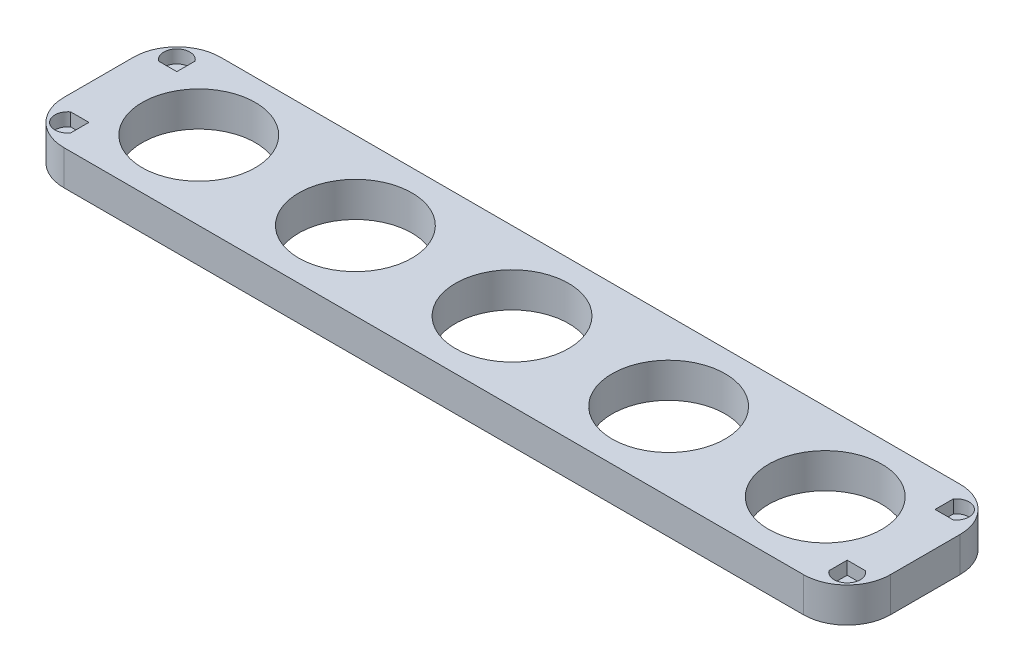
ISO-10303-21;
HEADER;
FILE_DESCRIPTION(('STEP AP214'),'2;1');
FILE_NAME('part.step','',(''),(''),'','','');
FILE_SCHEMA(('AUTOMOTIVE_DESIGN { 1 0 10303 214 1 1 1 1 }'));
ENDSEC;
DATA;
#1=APPLICATION_CONTEXT('core data for automotive mechanical design processes');
#2=APPLICATION_PROTOCOL_DEFINITION('international standard','automotive_design',2000,#1);
#3=PRODUCT_CONTEXT('',#1,'mechanical');
#4=PRODUCT('Part','Part','',(#3));
#5=PRODUCT_RELATED_PRODUCT_CATEGORY('part','',(#4));
#6=PRODUCT_DEFINITION_FORMATION('','',#4);
#7=PRODUCT_DEFINITION_CONTEXT('part definition',#1,'design');
#8=PRODUCT_DEFINITION('design','',#6,#7);
#9=PRODUCT_DEFINITION_SHAPE('','',#8);
#10=(LENGTH_UNIT() NAMED_UNIT(*) SI_UNIT(.MILLI.,.METRE.));
#11=(NAMED_UNIT(*) PLANE_ANGLE_UNIT() SI_UNIT($,.RADIAN.));
#12=(NAMED_UNIT(*) SI_UNIT($,.STERADIAN.) SOLID_ANGLE_UNIT());
#13=UNCERTAINTY_MEASURE_WITH_UNIT(LENGTH_MEASURE(1.E-05),#10,'distance_accuracy_value','');
#14=(GEOMETRIC_REPRESENTATION_CONTEXT(3) GLOBAL_UNCERTAINTY_ASSIGNED_CONTEXT((#13)) GLOBAL_UNIT_ASSIGNED_CONTEXT((#10,
#11,#12)) REPRESENTATION_CONTEXT('',''));
#15=CARTESIAN_POINT('',(0.,0.,0.));
#16=DIRECTION('',(0.,0.,1.));
#17=DIRECTION('',(1.,0.,0.));
#18=AXIS2_PLACEMENT_3D('',#15,#16,#17);
#19=CARTESIAN_POINT('',(0.,8.,0.));
#20=DIRECTION('',(0.,-1.,0.));
#21=DIRECTION('',(0.,0.,-1.));
#22=AXIS2_PLACEMENT_3D('',#19,#20,#21);
#23=PLANE('',#22);
#24=CARTESIAN_POINT('',(184.553451982046,8.,-30.5062125959102));
#25=DIRECTION('',(0.,-1.,0.));
#26=DIRECTION('',(0.,0.,-1.));
#27=AXIS2_PLACEMENT_3D('',#24,#25,#26);
#28=CIRCLE('',#27,3.00121510515277);
#29=CARTESIAN_POINT('',(182.147435554875,8.,-32.300196168739));
#30=VERTEX_POINT('',#29);
#31=CARTESIAN_POINT('',(186.347435554875,8.,-28.100196168739));
#32=VERTEX_POINT('',#31);
#33=EDGE_CURVE('E68',#30,#32,#28,.T.);
#34=ORIENTED_EDGE('',*,*,#33,.T.);
#35=DIRECTION('',(-1.,0.,0.));
#36=VECTOR('',#35,1.);
#37=CARTESIAN_POINT('',(186.347435554875,8.,-28.100196168739));
#38=LINE('',#37,#36);
#39=CARTESIAN_POINT('',(182.147435554875,8.,-28.100196168739));
#40=VERTEX_POINT('',#39);
#41=EDGE_CURVE('E268',#32,#40,#38,.T.);
#42=ORIENTED_EDGE('',*,*,#41,.T.);
#43=DIRECTION('',(0.,0.,-1.));
#44=VECTOR('',#43,1.);
#45=CARTESIAN_POINT('',(182.147435554875,8.,-28.100196168739));
#46=LINE('',#45,#44);
#47=EDGE_CURVE('E264',#40,#30,#46,.T.);
#48=ORIENTED_EDGE('',*,*,#47,.T.);
#49=EDGE_LOOP('',(#34,#42,#48));
#50=FACE_BOUND('',#49,.T.);
#51=CARTESIAN_POINT('',(184.553451982046,8.,-5.4937874040897));
#52=DIRECTION('',(0.,1.,0.));
#53=DIRECTION('',(0.,0.,1.));
#54=AXIS2_PLACEMENT_3D('',#51,#52,#53);
#55=CIRCLE('',#54,3.00121510515277);
#56=CARTESIAN_POINT('',(182.147435554875,8.,-3.69980383126085));
#57=VERTEX_POINT('',#56);
#58=CARTESIAN_POINT('',(186.347435554875,8.,-7.89980383126085));
#59=VERTEX_POINT('',#58);
#60=EDGE_CURVE('E206',#57,#59,#55,.T.);
#61=ORIENTED_EDGE('',*,*,#60,.F.);
#62=DIRECTION('',(0.,0.,1.));
#63=VECTOR('',#62,1.);
#64=CARTESIAN_POINT('',(182.147435554875,8.,-7.89980383126087));
#65=LINE('',#64,#63);
#66=CARTESIAN_POINT('',(182.147435554875,8.,-7.89980383126087));
#67=VERTEX_POINT('',#66);
#68=EDGE_CURVE('E189',#67,#57,#65,.T.);
#69=ORIENTED_EDGE('',*,*,#68,.F.);
#70=DIRECTION('',(-1.,0.,0.));
#71=VECTOR('',#70,1.);
#72=CARTESIAN_POINT('',(186.347435554875,8.,-7.89980383126086));
#73=LINE('',#72,#71);
#74=EDGE_CURVE('E200',#59,#67,#73,.T.);
#75=ORIENTED_EDGE('',*,*,#74,.F.);
#76=EDGE_LOOP('',(#61,#69,#75));
#77=FACE_BOUND('',#76,.T.);
#78=DIRECTION('',(0.,0.,-1.));
#79=VECTOR('',#78,1.);
#80=CARTESIAN_POINT('',(7.85256444512545,8.,-28.1001961687391));
#81=LINE('',#80,#79);
#82=CARTESIAN_POINT('',(7.85256444512545,8.,-28.1001961687391));
#83=VERTEX_POINT('',#82);
#84=CARTESIAN_POINT('',(7.85256444512545,8.,-32.3001961687391));
#85=VERTEX_POINT('',#84);
#86=EDGE_CURVE('E299',#83,#85,#81,.T.);
#87=ORIENTED_EDGE('',*,*,#86,.F.);
#88=DIRECTION('',(1.,0.,0.));
#89=VECTOR('',#88,1.);
#90=CARTESIAN_POINT('',(3.65256444512545,8.,-28.1001961687391));
#91=LINE('',#90,#89);
#92=CARTESIAN_POINT('',(3.65256444512544,8.,-28.1001961687391));
#93=VERTEX_POINT('',#92);
#94=EDGE_CURVE('E249',#93,#83,#91,.T.);
#95=ORIENTED_EDGE('',*,*,#94,.F.);
#96=CARTESIAN_POINT('',(5.44654801795428,8.,-30.5062125959102));
#97=DIRECTION('',(0.,1.,0.));
#98=DIRECTION('',(0.,0.,1.));
#99=AXIS2_PLACEMENT_3D('',#96,#97,#98);
#100=CIRCLE('',#99,3.00121510515278);
#101=EDGE_CURVE('E288',#85,#93,#100,.T.);
#102=ORIENTED_EDGE('',*,*,#101,.F.);
#103=EDGE_LOOP('',(#87,#95,#102));
#104=FACE_BOUND('',#103,.T.);
#105=CARTESIAN_POINT('',(23.,8.,-18.));
#106=DIRECTION('',(0.,1.,0.));
#107=DIRECTION('',(0.,0.,1.));
#108=AXIS2_PLACEMENT_3D('',#105,#106,#107);
#109=CIRCLE('',#108,13.);
#110=CARTESIAN_POINT('',(23.,8.,-4.99999999999999));
#111=VERTEX_POINT('',#110);
#112=EDGE_CURVE('E321',#111,#111,#109,.T.);
#113=ORIENTED_EDGE('',*,*,#112,.F.);
#114=EDGE_LOOP('',(#113));
#115=FACE_BOUND('',#114,.T.);
#116=CARTESIAN_POINT('',(59.,8.,-18.));
#117=DIRECTION('',(0.,1.,0.));
#118=DIRECTION('',(0.,0.,1.));
#119=AXIS2_PLACEMENT_3D('',#116,#117,#118);
#120=CIRCLE('',#119,13.);
#121=CARTESIAN_POINT('',(59.,8.,-4.99999999999998));
#122=VERTEX_POINT('',#121);
#123=EDGE_CURVE('E325',#122,#122,#120,.T.);
#124=ORIENTED_EDGE('',*,*,#123,.F.);
#125=EDGE_LOOP('',(#124));
#126=FACE_BOUND('',#125,.T.);
#127=CARTESIAN_POINT('',(95.0046201605951,8.,-18.));
#128=DIRECTION('',(0.,1.,0.));
#129=DIRECTION('',(0.,0.,1.));
#130=AXIS2_PLACEMENT_3D('',#127,#128,#129);
#131=CIRCLE('',#130,13.);
#132=CARTESIAN_POINT('',(95.0046201605951,8.,-5.));
#133=VERTEX_POINT('',#132);
#134=EDGE_CURVE('E333',#133,#133,#131,.T.);
#135=ORIENTED_EDGE('',*,*,#134,.F.);
#136=EDGE_LOOP('',(#135));
#137=FACE_BOUND('',#136,.T.);
#138=CARTESIAN_POINT('',(131.004620160595,8.,-18.));
#139=DIRECTION('',(0.,1.,0.));
#140=DIRECTION('',(0.,0.,1.));
#141=AXIS2_PLACEMENT_3D('',#138,#139,#140);
#142=CIRCLE('',#141,13.);
#143=CARTESIAN_POINT('',(131.004620160595,8.,-5.00000000000002));
#144=VERTEX_POINT('',#143);
#145=EDGE_CURVE('E341',#144,#144,#142,.T.);
#146=ORIENTED_EDGE('',*,*,#145,.F.);
#147=EDGE_LOOP('',(#146));
#148=FACE_BOUND('',#147,.T.);
#149=CARTESIAN_POINT('',(167.002310080298,8.,-18.));
#150=DIRECTION('',(0.,1.,0.));
#151=DIRECTION('',(0.,0.,1.));
#152=AXIS2_PLACEMENT_3D('',#149,#150,#151);
#153=CIRCLE('',#152,12.9976899197025);
#154=CARTESIAN_POINT('',(167.002310080298,8.,-5.00231008029754));
#155=VERTEX_POINT('',#154);
#156=EDGE_CURVE('E349',#155,#155,#153,.T.);
#157=ORIENTED_EDGE('',*,*,#156,.F.);
#158=EDGE_LOOP('',(#157));
#159=FACE_BOUND('',#158,.T.);
#160=DIRECTION('',(1.,0.,0.));
#161=VECTOR('',#160,1.);
#162=CARTESIAN_POINT('',(0.,8.,0.));
#163=LINE('',#162,#161);
#164=CARTESIAN_POINT('',(10.,8.,0.));
#165=VERTEX_POINT('',#164);
#166=CARTESIAN_POINT('',(180.,8.,0.));
#167=VERTEX_POINT('',#166);
#168=EDGE_CURVE('E360',#165,#167,#163,.T.);
#169=ORIENTED_EDGE('',*,*,#168,.T.);
#170=CARTESIAN_POINT('',(180.,8.,-10.));
#171=DIRECTION('',(0.,-1.,0.));
#172=DIRECTION('',(0.,0.,-1.));
#173=AXIS2_PLACEMENT_3D('',#170,#171,#172);
#174=CIRCLE('',#173,10.);
#175=CARTESIAN_POINT('',(190.,8.,-10.));
#176=VERTEX_POINT('',#175);
#177=EDGE_CURVE('E422',#167,#176,#174,.F.);
#178=ORIENTED_EDGE('',*,*,#177,.T.);
#179=DIRECTION('',(0.,0.,-1.));
#180=VECTOR('',#179,1.);
#181=CARTESIAN_POINT('',(190.,8.,0.));
#182=LINE('',#181,#180);
#183=CARTESIAN_POINT('',(190.,8.,-26.));
#184=VERTEX_POINT('',#183);
#185=EDGE_CURVE('E365',#176,#184,#182,.T.);
#186=ORIENTED_EDGE('',*,*,#185,.T.);
#187=CARTESIAN_POINT('',(180.,8.,-26.));
#188=DIRECTION('',(0.,-1.,0.));
#189=DIRECTION('',(0.,0.,-1.));
#190=AXIS2_PLACEMENT_3D('',#187,#188,#189);
#191=CIRCLE('',#190,10.);
#192=CARTESIAN_POINT('',(180.,8.,-36.));
#193=VERTEX_POINT('',#192);
#194=EDGE_CURVE('E419',#184,#193,#191,.F.);
#195=ORIENTED_EDGE('',*,*,#194,.T.);
#196=DIRECTION('',(-1.,0.,0.));
#197=VECTOR('',#196,1.);
#198=CARTESIAN_POINT('',(0.,8.,-36.));
#199=LINE('',#198,#197);
#200=CARTESIAN_POINT('',(10.,8.,-36.));
#201=VERTEX_POINT('',#200);
#202=EDGE_CURVE('E369',#193,#201,#199,.T.);
#203=ORIENTED_EDGE('',*,*,#202,.T.);
#204=CARTESIAN_POINT('',(10.,8.,-26.));
#205=DIRECTION('',(0.,-1.,0.));
#206=DIRECTION('',(0.,0.,-1.));
#207=AXIS2_PLACEMENT_3D('',#204,#205,#206);
#208=CIRCLE('',#207,10.);
#209=CARTESIAN_POINT('',(0.,8.,-26.));
#210=VERTEX_POINT('',#209);
#211=EDGE_CURVE('E416',#201,#210,#208,.F.);
#212=ORIENTED_EDGE('',*,*,#211,.T.);
#213=DIRECTION('',(0.,0.,1.));
#214=VECTOR('',#213,1.);
#215=CARTESIAN_POINT('',(0.,8.,0.));
#216=LINE('',#215,#214);
#217=CARTESIAN_POINT('',(0.,8.,-10.));
#218=VERTEX_POINT('',#217);
#219=EDGE_CURVE('E356',#210,#218,#216,.T.);
#220=ORIENTED_EDGE('',*,*,#219,.T.);
#221=CARTESIAN_POINT('',(10.,8.,-10.));
#222=DIRECTION('',(0.,-1.,0.));
#223=DIRECTION('',(0.,0.,-1.));
#224=AXIS2_PLACEMENT_3D('',#221,#222,#223);
#225=CIRCLE('',#224,10.);
#226=EDGE_CURVE('E413',#218,#165,#225,.F.);
#227=ORIENTED_EDGE('',*,*,#226,.T.);
#228=EDGE_LOOP('',(#169,#178,#186,#195,#203,#212,#220,#227));
#229=FACE_BOUND('',#228,.T.);
#230=CARTESIAN_POINT('',(5.44654801795428,8.,-5.49378740408977));
#231=DIRECTION('',(0.,-1.,0.));
#232=DIRECTION('',(0.,0.,-1.));
#233=AXIS2_PLACEMENT_3D('',#230,#231,#232);
#234=CIRCLE('',#233,3.00121510515278);
#235=CARTESIAN_POINT('',(7.85256444512545,8.,-3.69980383126093));
#236=VERTEX_POINT('',#235);
#237=CARTESIAN_POINT('',(3.65256444512545,8.,-7.89980383126093));
#238=VERTEX_POINT('',#237);
#239=EDGE_CURVE('E60',#236,#238,#234,.T.);
#240=ORIENTED_EDGE('',*,*,#239,.T.);
#241=DIRECTION('',(1.,0.,0.));
#242=VECTOR('',#241,1.);
#243=CARTESIAN_POINT('',(3.65256444512545,8.,-7.89980383126093));
#244=LINE('',#243,#242);
#245=CARTESIAN_POINT('',(7.85256444512545,8.,-7.89980383126094));
#246=VERTEX_POINT('',#245);
#247=EDGE_CURVE('E242',#238,#246,#244,.T.);
#248=ORIENTED_EDGE('',*,*,#247,.T.);
#249=DIRECTION('',(0.,0.,1.));
#250=VECTOR('',#249,1.);
#251=CARTESIAN_POINT('',(7.85256444512545,8.,-7.89980383126094));
#252=LINE('',#251,#250);
#253=EDGE_CURVE('E238',#246,#236,#252,.T.);
#254=ORIENTED_EDGE('',*,*,#253,.T.);
#255=EDGE_LOOP('',(#240,#248,#254));
#256=FACE_BOUND('',#255,.T.);
#257=ADVANCED_FACE('F44',(#50,#77,#104,#115,#126,#137,#148,#159,#229,#256),#23,.F.);
#258=CARTESIAN_POINT('',(0.,8.,0.));
#259=DIRECTION('',(1.,0.,0.));
#260=DIRECTION('',(0.,0.,-1.));
#261=AXIS2_PLACEMENT_3D('',#258,#259,#260);
#262=PLANE('',#261);
#263=ORIENTED_EDGE('',*,*,#219,.F.);
#264=DIRECTION('',(0.,-1.,0.));
#265=VECTOR('',#264,1.);
#266=CARTESIAN_POINT('',(0.,8.,-26.));
#267=LINE('',#266,#265);
#268=CARTESIAN_POINT('',(0.,0.,-26.));
#269=VERTEX_POINT('',#268);
#270=EDGE_CURVE('E11',#210,#269,#267,.T.);
#271=ORIENTED_EDGE('',*,*,#270,.T.);
#272=DIRECTION('',(0.,0.,1.));
#273=VECTOR('',#272,1.);
#274=CARTESIAN_POINT('',(0.,0.,0.));
#275=LINE('',#274,#273);
#276=CARTESIAN_POINT('',(0.,0.,-10.));
#277=VERTEX_POINT('',#276);
#278=EDGE_CURVE('E320',#269,#277,#275,.T.);
#279=ORIENTED_EDGE('',*,*,#278,.T.);
#280=DIRECTION('',(0.,-1.,0.));
#281=VECTOR('',#280,1.);
#282=CARTESIAN_POINT('',(0.,8.,-10.));
#283=LINE('',#282,#281);
#284=EDGE_CURVE('E53',#277,#218,#283,.F.);
#285=ORIENTED_EDGE('',*,*,#284,.T.);
#286=EDGE_LOOP('',(#263,#271,#279,#285));
#287=FACE_BOUND('',#286,.T.);
#288=ADVANCED_FACE('F435',(#287),#262,.F.);
#289=CARTESIAN_POINT('',(0.,8.,0.));
#290=DIRECTION('',(0.,0.,-1.));
#291=DIRECTION('',(-1.,0.,0.));
#292=AXIS2_PLACEMENT_3D('',#289,#290,#291);
#293=PLANE('',#292);
#294=DIRECTION('',(1.,0.,0.));
#295=VECTOR('',#294,1.);
#296=CARTESIAN_POINT('',(0.,0.,0.));
#297=LINE('',#296,#295);
#298=CARTESIAN_POINT('',(10.,0.,0.));
#299=VERTEX_POINT('',#298);
#300=CARTESIAN_POINT('',(180.,0.,0.));
#301=VERTEX_POINT('',#300);
#302=EDGE_CURVE('E377',#299,#301,#297,.T.);
#303=ORIENTED_EDGE('',*,*,#302,.T.);
#304=DIRECTION('',(0.,-1.,0.));
#305=VECTOR('',#304,1.);
#306=CARTESIAN_POINT('',(180.,8.,0.));
#307=LINE('',#306,#305);
#308=EDGE_CURVE('E410',#301,#167,#307,.F.);
#309=ORIENTED_EDGE('',*,*,#308,.T.);
#310=ORIENTED_EDGE('',*,*,#168,.F.);
#311=DIRECTION('',(0.,-1.,0.));
#312=VECTOR('',#311,1.);
#313=CARTESIAN_POINT('',(10.,8.,0.));
#314=LINE('',#313,#312);
#315=EDGE_CURVE('E406',#165,#299,#314,.T.);
#316=ORIENTED_EDGE('',*,*,#315,.T.);
#317=EDGE_LOOP('',(#303,#309,#310,#316));
#318=FACE_BOUND('',#317,.T.);
#319=ADVANCED_FACE('F447',(#318),#293,.F.);
#320=CARTESIAN_POINT('',(190.,8.,0.));
#321=DIRECTION('',(-1.,0.,0.));
#322=DIRECTION('',(0.,0.,1.));
#323=AXIS2_PLACEMENT_3D('',#320,#321,#322);
#324=PLANE('',#323);
#325=ORIENTED_EDGE('',*,*,#185,.F.);
#326=DIRECTION('',(0.,-1.,0.));
#327=VECTOR('',#326,1.);
#328=CARTESIAN_POINT('',(190.,8.,-10.));
#329=LINE('',#328,#327);
#330=CARTESIAN_POINT('',(190.,0.,-10.));
#331=VERTEX_POINT('',#330);
#332=EDGE_CURVE('E390',#176,#331,#329,.T.);
#333=ORIENTED_EDGE('',*,*,#332,.T.);
#334=DIRECTION('',(0.,0.,-1.));
#335=VECTOR('',#334,1.);
#336=CARTESIAN_POINT('',(190.,0.,0.));
#337=LINE('',#336,#335);
#338=CARTESIAN_POINT('',(190.,0.,-26.));
#339=VERTEX_POINT('',#338);
#340=EDGE_CURVE('E381',#331,#339,#337,.T.);
#341=ORIENTED_EDGE('',*,*,#340,.T.);
#342=DIRECTION('',(0.,-1.,0.));
#343=VECTOR('',#342,1.);
#344=CARTESIAN_POINT('',(190.,8.,-26.));
#345=LINE('',#344,#343);
#346=EDGE_CURVE('E373',#339,#184,#345,.F.);
#347=ORIENTED_EDGE('',*,*,#346,.T.);
#348=EDGE_LOOP('',(#325,#333,#341,#347));
#349=FACE_BOUND('',#348,.T.);
#350=ADVANCED_FACE('F458',(#349),#324,.F.);
#351=CARTESIAN_POINT('',(0.,8.,-36.));
#352=DIRECTION('',(0.,0.,1.));
#353=DIRECTION('',(1.,0.,0.));
#354=AXIS2_PLACEMENT_3D('',#351,#352,#353);
#355=PLANE('',#354);
#356=ORIENTED_EDGE('',*,*,#202,.F.);
#357=DIRECTION('',(0.,-1.,0.));
#358=VECTOR('',#357,1.);
#359=CARTESIAN_POINT('',(180.,8.,-36.));
#360=LINE('',#359,#358);
#361=CARTESIAN_POINT('',(180.,0.,-36.));
#362=VERTEX_POINT('',#361);
#363=EDGE_CURVE('E428',#193,#362,#360,.T.);
#364=ORIENTED_EDGE('',*,*,#363,.T.);
#365=DIRECTION('',(-1.,0.,0.));
#366=VECTOR('',#365,1.);
#367=CARTESIAN_POINT('',(0.,0.,-36.));
#368=LINE('',#367,#366);
#369=CARTESIAN_POINT('',(10.,0.,-36.));
#370=VERTEX_POINT('',#369);
#371=EDGE_CURVE('E361',#362,#370,#368,.T.);
#372=ORIENTED_EDGE('',*,*,#371,.T.);
#373=DIRECTION('',(0.,-1.,0.));
#374=VECTOR('',#373,1.);
#375=CARTESIAN_POINT('',(10.,8.,-36.));
#376=LINE('',#375,#374);
#377=EDGE_CURVE('E425',#370,#201,#376,.F.);
#378=ORIENTED_EDGE('',*,*,#377,.T.);
#379=EDGE_LOOP('',(#356,#364,#372,#378));
#380=FACE_BOUND('',#379,.T.);
#381=ADVANCED_FACE('F467',(#380),#355,.F.);
#382=CARTESIAN_POINT('',(0.,0.,0.));
#383=DIRECTION('',(0.,-1.,0.));
#384=DIRECTION('',(0.,0.,-1.));
#385=AXIS2_PLACEMENT_3D('',#382,#383,#384);
#386=PLANE('',#385);
#387=CARTESIAN_POINT('',(23.,0.,-18.));
#388=DIRECTION('',(0.,1.,0.));
#389=DIRECTION('',(0.,0.,1.));
#390=AXIS2_PLACEMENT_3D('',#387,#388,#389);
#391=CIRCLE('',#390,13.);
#392=CARTESIAN_POINT('',(23.,0.,-4.99999999999999));
#393=VERTEX_POINT('',#392);
#394=EDGE_CURVE('E316',#393,#393,#391,.T.);
#395=ORIENTED_EDGE('',*,*,#394,.T.);
#396=EDGE_LOOP('',(#395));
#397=FACE_BOUND('',#396,.T.);
#398=CARTESIAN_POINT('',(59.,0.,-18.));
#399=DIRECTION('',(0.,1.,0.));
#400=DIRECTION('',(0.,0.,1.));
#401=AXIS2_PLACEMENT_3D('',#398,#399,#400);
#402=CIRCLE('',#401,13.);
#403=CARTESIAN_POINT('',(59.,0.,-4.99999999999998));
#404=VERTEX_POINT('',#403);
#405=EDGE_CURVE('E329',#404,#404,#402,.T.);
#406=ORIENTED_EDGE('',*,*,#405,.T.);
#407=EDGE_LOOP('',(#406));
#408=FACE_BOUND('',#407,.T.);
#409=CARTESIAN_POINT('',(95.0046201605951,0.,-18.));
#410=DIRECTION('',(0.,1.,0.));
#411=DIRECTION('',(0.,0.,1.));
#412=AXIS2_PLACEMENT_3D('',#409,#410,#411);
#413=CIRCLE('',#412,13.);
#414=CARTESIAN_POINT('',(95.0046201605951,0.,-5.));
#415=VERTEX_POINT('',#414);
#416=EDGE_CURVE('E337',#415,#415,#413,.T.);
#417=ORIENTED_EDGE('',*,*,#416,.T.);
#418=EDGE_LOOP('',(#417));
#419=FACE_BOUND('',#418,.T.);
#420=CARTESIAN_POINT('',(131.004620160595,0.,-18.));
#421=DIRECTION('',(0.,1.,0.));
#422=DIRECTION('',(0.,0.,1.));
#423=AXIS2_PLACEMENT_3D('',#420,#421,#422);
#424=CIRCLE('',#423,13.);
#425=CARTESIAN_POINT('',(131.004620160595,0.,-5.00000000000002));
#426=VERTEX_POINT('',#425);
#427=EDGE_CURVE('E345',#426,#426,#424,.T.);
#428=ORIENTED_EDGE('',*,*,#427,.T.);
#429=EDGE_LOOP('',(#428));
#430=FACE_BOUND('',#429,.T.);
#431=CARTESIAN_POINT('',(167.002310080298,0.,-18.));
#432=DIRECTION('',(0.,1.,0.));
#433=DIRECTION('',(0.,0.,1.));
#434=AXIS2_PLACEMENT_3D('',#431,#432,#433);
#435=CIRCLE('',#434,12.9976899197025);
#436=CARTESIAN_POINT('',(167.002310080298,0.,-5.00231008029754));
#437=VERTEX_POINT('',#436);
#438=EDGE_CURVE('E309',#437,#437,#435,.T.);
#439=ORIENTED_EDGE('',*,*,#438,.T.);
#440=EDGE_LOOP('',(#439));
#441=FACE_BOUND('',#440,.T.);
#442=ORIENTED_EDGE('',*,*,#340,.F.);
#443=CARTESIAN_POINT('',(180.,0.,-10.));
#444=DIRECTION('',(0.,-1.,0.));
#445=DIRECTION('',(0.,0.,-1.));
#446=AXIS2_PLACEMENT_3D('',#443,#444,#445);
#447=CIRCLE('',#446,10.);
#448=EDGE_CURVE('E403',#331,#301,#447,.T.);
#449=ORIENTED_EDGE('',*,*,#448,.T.);
#450=ORIENTED_EDGE('',*,*,#302,.F.);
#451=CARTESIAN_POINT('',(10.,0.,-10.));
#452=DIRECTION('',(0.,-1.,0.));
#453=DIRECTION('',(0.,0.,-1.));
#454=AXIS2_PLACEMENT_3D('',#451,#452,#453);
#455=CIRCLE('',#454,10.);
#456=EDGE_CURVE('E394',#299,#277,#455,.T.);
#457=ORIENTED_EDGE('',*,*,#456,.T.);
#458=ORIENTED_EDGE('',*,*,#278,.F.);
#459=CARTESIAN_POINT('',(10.,0.,-26.));
#460=DIRECTION('',(0.,-1.,0.));
#461=DIRECTION('',(0.,0.,-1.));
#462=AXIS2_PLACEMENT_3D('',#459,#460,#461);
#463=CIRCLE('',#462,10.);
#464=EDGE_CURVE('E397',#269,#370,#463,.T.);
#465=ORIENTED_EDGE('',*,*,#464,.T.);
#466=ORIENTED_EDGE('',*,*,#371,.F.);
#467=CARTESIAN_POINT('',(180.,0.,-26.));
#468=DIRECTION('',(0.,-1.,0.));
#469=DIRECTION('',(0.,0.,-1.));
#470=AXIS2_PLACEMENT_3D('',#467,#468,#469);
#471=CIRCLE('',#470,10.);
#472=EDGE_CURVE('E400',#362,#339,#471,.T.);
#473=ORIENTED_EDGE('',*,*,#472,.T.);
#474=EDGE_LOOP('',(#442,#449,#450,#457,#458,#465,#466,#473));
#475=FACE_BOUND('',#474,.T.);
#476=ADVANCED_FACE('F451',(#397,#408,#419,#430,#441,#475),#386,.T.);
#477=CARTESIAN_POINT('',(167.002310080298,0.,-18.));
#478=DIRECTION('',(0.,1.,0.));
#479=DIRECTION('',(0.,0.,1.));
#480=AXIS2_PLACEMENT_3D('',#477,#478,#479);
#481=CYLINDRICAL_SURFACE('',#480,12.9976899197025);
#482=ORIENTED_EDGE('',*,*,#438,.F.);
#483=EDGE_LOOP('',(#482));
#484=FACE_BOUND('',#483,.T.);
#485=ORIENTED_EDGE('',*,*,#156,.T.);
#486=EDGE_LOOP('',(#485));
#487=FACE_BOUND('',#486,.T.);
#488=ADVANCED_FACE('F488',(#484,#487),#481,.F.);
#489=CARTESIAN_POINT('',(131.004620160595,0.,-18.));
#490=DIRECTION('',(0.,1.,0.));
#491=DIRECTION('',(0.,0.,1.));
#492=AXIS2_PLACEMENT_3D('',#489,#490,#491);
#493=CYLINDRICAL_SURFACE('',#492,13.);
#494=ORIENTED_EDGE('',*,*,#427,.F.);
#495=EDGE_LOOP('',(#494));
#496=FACE_BOUND('',#495,.T.);
#497=ORIENTED_EDGE('',*,*,#145,.T.);
#498=EDGE_LOOP('',(#497));
#499=FACE_BOUND('',#498,.T.);
#500=ADVANCED_FACE('F519',(#496,#499),#493,.F.);
#501=CARTESIAN_POINT('',(95.0046201605951,0.,-18.));
#502=DIRECTION('',(0.,1.,0.));
#503=DIRECTION('',(0.,0.,1.));
#504=AXIS2_PLACEMENT_3D('',#501,#502,#503);
#505=CYLINDRICAL_SURFACE('',#504,13.);
#506=ORIENTED_EDGE('',*,*,#416,.F.);
#507=EDGE_LOOP('',(#506));
#508=FACE_BOUND('',#507,.T.);
#509=ORIENTED_EDGE('',*,*,#134,.T.);
#510=EDGE_LOOP('',(#509));
#511=FACE_BOUND('',#510,.T.);
#512=ADVANCED_FACE('F510',(#508,#511),#505,.F.);
#513=CARTESIAN_POINT('',(59.,0.,-18.));
#514=DIRECTION('',(0.,1.,0.));
#515=DIRECTION('',(0.,0.,1.));
#516=AXIS2_PLACEMENT_3D('',#513,#514,#515);
#517=CYLINDRICAL_SURFACE('',#516,13.);
#518=ORIENTED_EDGE('',*,*,#405,.F.);
#519=EDGE_LOOP('',(#518));
#520=FACE_BOUND('',#519,.T.);
#521=ORIENTED_EDGE('',*,*,#123,.T.);
#522=EDGE_LOOP('',(#521));
#523=FACE_BOUND('',#522,.T.);
#524=ADVANCED_FACE('F504',(#520,#523),#517,.F.);
#525=CARTESIAN_POINT('',(23.,0.,-18.));
#526=DIRECTION('',(0.,1.,0.));
#527=DIRECTION('',(0.,0.,1.));
#528=AXIS2_PLACEMENT_3D('',#525,#526,#527);
#529=CYLINDRICAL_SURFACE('',#528,13.);
#530=ORIENTED_EDGE('',*,*,#394,.F.);
#531=EDGE_LOOP('',(#530));
#532=FACE_BOUND('',#531,.T.);
#533=ORIENTED_EDGE('',*,*,#112,.T.);
#534=EDGE_LOOP('',(#533));
#535=FACE_BOUND('',#534,.T.);
#536=ADVANCED_FACE('F500',(#532,#535),#529,.F.);
#537=CARTESIAN_POINT('',(180.,8.,-10.));
#538=DIRECTION('',(0.,-1.,0.));
#539=DIRECTION('',(0.,0.,-1.));
#540=AXIS2_PLACEMENT_3D('',#537,#538,#539);
#541=CYLINDRICAL_SURFACE('',#540,10.);
#542=ORIENTED_EDGE('',*,*,#177,.F.);
#543=ORIENTED_EDGE('',*,*,#308,.F.);
#544=ORIENTED_EDGE('',*,*,#448,.F.);
#545=ORIENTED_EDGE('',*,*,#332,.F.);
#546=EDGE_LOOP('',(#542,#543,#544,#545));
#547=FACE_BOUND('',#546,.T.);
#548=ADVANCED_FACE('F455',(#547),#541,.T.);
#549=CARTESIAN_POINT('',(180.,8.,-26.));
#550=DIRECTION('',(0.,-1.,0.));
#551=DIRECTION('',(0.,0.,-1.));
#552=AXIS2_PLACEMENT_3D('',#549,#550,#551);
#553=CYLINDRICAL_SURFACE('',#552,10.);
#554=ORIENTED_EDGE('',*,*,#194,.F.);
#555=ORIENTED_EDGE('',*,*,#346,.F.);
#556=ORIENTED_EDGE('',*,*,#472,.F.);
#557=ORIENTED_EDGE('',*,*,#363,.F.);
#558=EDGE_LOOP('',(#554,#555,#556,#557));
#559=FACE_BOUND('',#558,.T.);
#560=ADVANCED_FACE('F464',(#559),#553,.T.);
#561=CARTESIAN_POINT('',(10.,8.,-26.));
#562=DIRECTION('',(0.,-1.,0.));
#563=DIRECTION('',(0.,0.,-1.));
#564=AXIS2_PLACEMENT_3D('',#561,#562,#563);
#565=CYLINDRICAL_SURFACE('',#564,10.);
#566=ORIENTED_EDGE('',*,*,#211,.F.);
#567=ORIENTED_EDGE('',*,*,#377,.F.);
#568=ORIENTED_EDGE('',*,*,#464,.F.);
#569=ORIENTED_EDGE('',*,*,#270,.F.);
#570=EDGE_LOOP('',(#566,#567,#568,#569));
#571=FACE_BOUND('',#570,.T.);
#572=ADVANCED_FACE('F470',(#571),#565,.T.);
#573=CARTESIAN_POINT('',(10.,8.,-10.));
#574=DIRECTION('',(0.,-1.,0.));
#575=DIRECTION('',(0.,0.,-1.));
#576=AXIS2_PLACEMENT_3D('',#573,#574,#575);
#577=CYLINDRICAL_SURFACE('',#576,10.);
#578=ORIENTED_EDGE('',*,*,#226,.F.);
#579=ORIENTED_EDGE('',*,*,#284,.F.);
#580=ORIENTED_EDGE('',*,*,#456,.F.);
#581=ORIENTED_EDGE('',*,*,#315,.F.);
#582=EDGE_LOOP('',(#578,#579,#580,#581));
#583=FACE_BOUND('',#582,.T.);
#584=ADVANCED_FACE('F46',(#583),#577,.T.);
#585=CARTESIAN_POINT('',(3.65256444512545,5.,-28.1001961687391));
#586=DIRECTION('',(0.,0.,1.));
#587=DIRECTION('',(1.,0.,0.));
#588=AXIS2_PLACEMENT_3D('',#585,#586,#587);
#589=PLANE('',#588);
#590=ORIENTED_EDGE('',*,*,#94,.T.);
#591=DIRECTION('',(0.,1.,0.));
#592=VECTOR('',#591,1.);
#593=CARTESIAN_POINT('',(7.85256444512545,5.,-28.1001961687391));
#594=LINE('',#593,#592);
#595=CARTESIAN_POINT('',(7.85256444512545,5.,-28.1001961687391));
#596=VERTEX_POINT('',#595);
#597=EDGE_CURVE('E296',#596,#83,#594,.T.);
#598=ORIENTED_EDGE('',*,*,#597,.F.);
#599=DIRECTION('',(1.,0.,0.));
#600=VECTOR('',#599,1.);
#601=CARTESIAN_POINT('',(3.65256444512545,5.,-28.1001961687391));
#602=LINE('',#601,#600);
#603=CARTESIAN_POINT('',(3.65256444512544,5.,-28.1001961687391));
#604=VERTEX_POINT('',#603);
#605=EDGE_CURVE('E283',#604,#596,#602,.T.);
#606=ORIENTED_EDGE('',*,*,#605,.F.);
#607=DIRECTION('',(0.,1.,0.));
#608=VECTOR('',#607,1.);
#609=CARTESIAN_POINT('',(3.65256444512544,5.,-28.1001961687391));
#610=LINE('',#609,#608);
#611=EDGE_CURVE('E306',#604,#93,#610,.T.);
#612=ORIENTED_EDGE('',*,*,#611,.T.);
#613=EDGE_LOOP('',(#590,#598,#606,#612));
#614=FACE_BOUND('',#613,.T.);
#615=ADVANCED_FACE('F476',(#614),#589,.F.);
#616=CARTESIAN_POINT('',(5.44654801795428,5.,-30.5062125959102));
#617=DIRECTION('',(0.,1.,0.));
#618=DIRECTION('',(0.,0.,1.));
#619=AXIS2_PLACEMENT_3D('',#616,#617,#618);
#620=CYLINDRICAL_SURFACE('',#619,3.00121510515278);
#621=ORIENTED_EDGE('',*,*,#101,.T.);
#622=ORIENTED_EDGE('',*,*,#611,.F.);
#623=CARTESIAN_POINT('',(5.44654801795428,5.,-30.5062125959102));
#624=DIRECTION('',(0.,1.,0.));
#625=DIRECTION('',(0.,0.,1.));
#626=AXIS2_PLACEMENT_3D('',#623,#624,#625);
#627=CIRCLE('',#626,3.00121510515278);
#628=CARTESIAN_POINT('',(7.85256444512545,5.,-32.3001961687391));
#629=VERTEX_POINT('',#628);
#630=EDGE_CURVE('E292',#629,#604,#627,.T.);
#631=ORIENTED_EDGE('',*,*,#630,.F.);
#632=DIRECTION('',(0.,1.,0.));
#633=VECTOR('',#632,1.);
#634=CARTESIAN_POINT('',(7.85256444512545,5.,-32.3001961687391));
#635=LINE('',#634,#633);
#636=EDGE_CURVE('E310',#629,#85,#635,.T.);
#637=ORIENTED_EDGE('',*,*,#636,.T.);
#638=EDGE_LOOP('',(#621,#622,#631,#637));
#639=FACE_BOUND('',#638,.T.);
#640=ADVANCED_FACE('F597',(#639),#620,.F.);
#641=CARTESIAN_POINT('',(7.85256444512545,5.,-28.1001961687391));
#642=DIRECTION('',(1.,0.,0.));
#643=DIRECTION('',(0.,0.,-1.));
#644=AXIS2_PLACEMENT_3D('',#641,#642,#643);
#645=PLANE('',#644);
#646=ORIENTED_EDGE('',*,*,#86,.T.);
#647=ORIENTED_EDGE('',*,*,#636,.F.);
#648=DIRECTION('',(0.,0.,-1.));
#649=VECTOR('',#648,1.);
#650=CARTESIAN_POINT('',(7.85256444512545,5.,-28.1001961687391));
#651=LINE('',#650,#649);
#652=EDGE_CURVE('E287',#596,#629,#651,.T.);
#653=ORIENTED_EDGE('',*,*,#652,.F.);
#654=ORIENTED_EDGE('',*,*,#597,.T.);
#655=EDGE_LOOP('',(#646,#647,#653,#654));
#656=FACE_BOUND('',#655,.T.);
#657=ADVANCED_FACE('F606',(#656),#645,.F.);
#658=CARTESIAN_POINT('',(5.44654801795428,5.,-30.5062125959102));
#659=DIRECTION('',(0.,1.,0.));
#660=DIRECTION('',(0.,0.,1.));
#661=AXIS2_PLACEMENT_3D('',#658,#659,#660);
#662=PLANE('',#661);
#663=ORIENTED_EDGE('',*,*,#605,.T.);
#664=ORIENTED_EDGE('',*,*,#652,.T.);
#665=ORIENTED_EDGE('',*,*,#630,.T.);
#666=EDGE_LOOP('',(#663,#664,#665));
#667=FACE_BOUND('',#666,.T.);
#668=ADVANCED_FACE('F616',(#667),#662,.T.);
#669=CARTESIAN_POINT('',(182.147435554875,5.,-7.89980383126087));
#670=DIRECTION('',(-1.,0.,0.));
#671=DIRECTION('',(0.,0.,1.));
#672=AXIS2_PLACEMENT_3D('',#669,#670,#671);
#673=PLANE('',#672);
#674=ORIENTED_EDGE('',*,*,#68,.T.);
#675=DIRECTION('',(0.,1.,0.));
#676=VECTOR('',#675,1.);
#677=CARTESIAN_POINT('',(182.147435554875,5.,-3.69980383126085));
#678=LINE('',#677,#676);
#679=CARTESIAN_POINT('',(182.147435554875,5.,-3.69980383126085));
#680=VERTEX_POINT('',#679);
#681=EDGE_CURVE('E222',#680,#57,#678,.T.);
#682=ORIENTED_EDGE('',*,*,#681,.F.);
#683=DIRECTION('',(0.,0.,1.));
#684=VECTOR('',#683,1.);
#685=CARTESIAN_POINT('',(182.147435554875,5.,-7.89980383126087));
#686=LINE('',#685,#684);
#687=CARTESIAN_POINT('',(182.147435554875,5.,-7.89980383126087));
#688=VERTEX_POINT('',#687);
#689=EDGE_CURVE('E192',#688,#680,#686,.T.);
#690=ORIENTED_EDGE('',*,*,#689,.F.);
#691=DIRECTION('',(0.,1.,0.));
#692=VECTOR('',#691,1.);
#693=CARTESIAN_POINT('',(182.147435554875,5.,-7.89980383126087));
#694=LINE('',#693,#692);
#695=EDGE_CURVE('E185',#688,#67,#694,.T.);
#696=ORIENTED_EDGE('',*,*,#695,.T.);
#697=EDGE_LOOP('',(#674,#682,#690,#696));
#698=FACE_BOUND('',#697,.T.);
#699=ADVANCED_FACE('F187',(#698),#673,.F.);
#700=CARTESIAN_POINT('',(186.347435554875,5.,-7.89980383126086));
#701=DIRECTION('',(0.,0.,-1.));
#702=DIRECTION('',(-1.,0.,0.));
#703=AXIS2_PLACEMENT_3D('',#700,#701,#702);
#704=PLANE('',#703);
#705=ORIENTED_EDGE('',*,*,#74,.T.);
#706=ORIENTED_EDGE('',*,*,#695,.F.);
#707=DIRECTION('',(-1.,0.,0.));
#708=VECTOR('',#707,1.);
#709=CARTESIAN_POINT('',(186.347435554875,5.,-7.89980383126086));
#710=LINE('',#709,#708);
#711=CARTESIAN_POINT('',(186.347435554875,5.,-7.89980383126085));
#712=VERTEX_POINT('',#711);
#713=EDGE_CURVE('E218',#712,#688,#710,.T.);
#714=ORIENTED_EDGE('',*,*,#713,.F.);
#715=DIRECTION('',(0.,1.,0.));
#716=VECTOR('',#715,1.);
#717=CARTESIAN_POINT('',(186.347435554875,5.,-7.89980383126085));
#718=LINE('',#717,#716);
#719=EDGE_CURVE('E197',#712,#59,#718,.T.);
#720=ORIENTED_EDGE('',*,*,#719,.T.);
#721=EDGE_LOOP('',(#705,#706,#714,#720));
#722=FACE_BOUND('',#721,.T.);
#723=ADVANCED_FACE('F201',(#722),#704,.F.);
#724=CARTESIAN_POINT('',(184.553451982046,5.,-5.4937874040897));
#725=DIRECTION('',(0.,1.,0.));
#726=DIRECTION('',(0.,0.,1.));
#727=AXIS2_PLACEMENT_3D('',#724,#725,#726);
#728=CYLINDRICAL_SURFACE('',#727,3.00121510515277);
#729=ORIENTED_EDGE('',*,*,#60,.T.);
#730=ORIENTED_EDGE('',*,*,#719,.F.);
#731=CARTESIAN_POINT('',(184.553451982046,5.,-5.4937874040897));
#732=DIRECTION('',(0.,1.,0.));
#733=DIRECTION('',(0.,0.,1.));
#734=AXIS2_PLACEMENT_3D('',#731,#732,#733);
#735=CIRCLE('',#734,3.00121510515277);
#736=EDGE_CURVE('E221',#680,#712,#735,.T.);
#737=ORIENTED_EDGE('',*,*,#736,.F.);
#738=ORIENTED_EDGE('',*,*,#681,.T.);
#739=EDGE_LOOP('',(#729,#730,#737,#738));
#740=FACE_BOUND('',#739,.T.);
#741=ADVANCED_FACE('F642',(#740),#728,.F.);
#742=CARTESIAN_POINT('',(184.553451982046,5.,-5.4937874040897));
#743=DIRECTION('',(0.,1.,0.));
#744=DIRECTION('',(0.,0.,1.));
#745=AXIS2_PLACEMENT_3D('',#742,#743,#744);
#746=PLANE('',#745);
#747=ORIENTED_EDGE('',*,*,#689,.T.);
#748=ORIENTED_EDGE('',*,*,#736,.T.);
#749=ORIENTED_EDGE('',*,*,#713,.T.);
#750=EDGE_LOOP('',(#747,#748,#749));
#751=FACE_BOUND('',#750,.T.);
#752=ADVANCED_FACE('F651',(#751),#746,.T.);
#753=CARTESIAN_POINT('',(184.553451982046,5.,-30.5062125959102));
#754=DIRECTION('',(0.,1.,0.));
#755=DIRECTION('',(0.,0.,1.));
#756=AXIS2_PLACEMENT_3D('',#753,#754,#755);
#757=CYLINDRICAL_SURFACE('',#756,3.00121510515277);
#758=ORIENTED_EDGE('',*,*,#33,.F.);
#759=DIRECTION('',(0.,1.,0.));
#760=VECTOR('',#759,1.);
#761=CARTESIAN_POINT('',(182.147435554875,5.,-32.300196168739));
#762=LINE('',#761,#760);
#763=CARTESIAN_POINT('',(182.147435554875,5.,-32.300196168739));
#764=VERTEX_POINT('',#763);
#765=EDGE_CURVE('E260',#764,#30,#762,.T.);
#766=ORIENTED_EDGE('',*,*,#765,.F.);
#767=CARTESIAN_POINT('',(184.553451982046,5.,-30.5062125959102));
#768=DIRECTION('',(0.,-1.,0.));
#769=DIRECTION('',(0.,0.,-1.));
#770=AXIS2_PLACEMENT_3D('',#767,#768,#769);
#771=CIRCLE('',#770,3.00121510515277);
#772=CARTESIAN_POINT('',(186.347435554875,5.,-28.100196168739));
#773=VERTEX_POINT('',#772);
#774=EDGE_CURVE('E269',#764,#773,#771,.T.);
#775=ORIENTED_EDGE('',*,*,#774,.T.);
#776=DIRECTION('',(0.,1.,0.));
#777=VECTOR('',#776,1.);
#778=CARTESIAN_POINT('',(186.347435554875,5.,-28.100196168739));
#779=LINE('',#778,#777);
#780=EDGE_CURVE('E210',#773,#32,#779,.T.);
#781=ORIENTED_EDGE('',*,*,#780,.T.);
#782=EDGE_LOOP('',(#758,#766,#775,#781));
#783=FACE_BOUND('',#782,.T.);
#784=ADVANCED_FACE('F661',(#783),#757,.F.);
#785=CARTESIAN_POINT('',(186.347435554875,5.,-28.100196168739));
#786=DIRECTION('',(0.,0.,-1.));
#787=DIRECTION('',(-1.,0.,0.));
#788=AXIS2_PLACEMENT_3D('',#785,#786,#787);
#789=PLANE('',#788);
#790=ORIENTED_EDGE('',*,*,#41,.F.);
#791=ORIENTED_EDGE('',*,*,#780,.F.);
#792=DIRECTION('',(-1.,0.,0.));
#793=VECTOR('',#792,1.);
#794=CARTESIAN_POINT('',(186.347435554875,5.,-28.100196168739));
#795=LINE('',#794,#793);
#796=CARTESIAN_POINT('',(182.147435554875,5.,-28.100196168739));
#797=VERTEX_POINT('',#796);
#798=EDGE_CURVE('E277',#773,#797,#795,.T.);
#799=ORIENTED_EDGE('',*,*,#798,.T.);
#800=DIRECTION('',(0.,1.,0.));
#801=VECTOR('',#800,1.);
#802=CARTESIAN_POINT('',(182.147435554875,5.,-28.100196168739));
#803=LINE('',#802,#801);
#804=EDGE_CURVE('E214',#797,#40,#803,.T.);
#805=ORIENTED_EDGE('',*,*,#804,.T.);
#806=EDGE_LOOP('',(#790,#791,#799,#805));
#807=FACE_BOUND('',#806,.T.);
#808=ADVANCED_FACE('F671',(#807),#789,.T.);
#809=CARTESIAN_POINT('',(182.147435554875,5.,-28.100196168739));
#810=DIRECTION('',(1.,0.,0.));
#811=DIRECTION('',(0.,0.,-1.));
#812=AXIS2_PLACEMENT_3D('',#809,#810,#811);
#813=PLANE('',#812);
#814=ORIENTED_EDGE('',*,*,#47,.F.);
#815=ORIENTED_EDGE('',*,*,#804,.F.);
#816=DIRECTION('',(0.,0.,-1.));
#817=VECTOR('',#816,1.);
#818=CARTESIAN_POINT('',(182.147435554875,5.,-28.100196168739));
#819=LINE('',#818,#817);
#820=EDGE_CURVE('E263',#797,#764,#819,.T.);
#821=ORIENTED_EDGE('',*,*,#820,.T.);
#822=ORIENTED_EDGE('',*,*,#765,.T.);
#823=EDGE_LOOP('',(#814,#815,#821,#822));
#824=FACE_BOUND('',#823,.T.);
#825=ADVANCED_FACE('F680',(#824),#813,.T.);
#826=CARTESIAN_POINT('',(184.553451982046,5.,-30.5062125959102));
#827=DIRECTION('',(0.,-1.,0.));
#828=DIRECTION('',(0.,0.,-1.));
#829=AXIS2_PLACEMENT_3D('',#826,#827,#828);
#830=PLANE('',#829);
#831=ORIENTED_EDGE('',*,*,#774,.F.);
#832=ORIENTED_EDGE('',*,*,#820,.F.);
#833=ORIENTED_EDGE('',*,*,#798,.F.);
#834=EDGE_LOOP('',(#831,#832,#833));
#835=FACE_BOUND('',#834,.T.);
#836=ADVANCED_FACE('F690',(#835),#830,.F.);
#837=CARTESIAN_POINT('',(5.44654801795428,5.,-5.49378740408977));
#838=DIRECTION('',(0.,1.,0.));
#839=DIRECTION('',(0.,0.,1.));
#840=AXIS2_PLACEMENT_3D('',#837,#838,#839);
#841=CYLINDRICAL_SURFACE('',#840,3.00121510515278);
#842=ORIENTED_EDGE('',*,*,#239,.F.);
#843=DIRECTION('',(0.,1.,0.));
#844=VECTOR('',#843,1.);
#845=CARTESIAN_POINT('',(7.85256444512545,5.,-3.69980383126093));
#846=LINE('',#845,#844);
#847=CARTESIAN_POINT('',(7.85256444512545,5.,-3.69980383126093));
#848=VERTEX_POINT('',#847);
#849=EDGE_CURVE('E234',#848,#236,#846,.T.);
#850=ORIENTED_EDGE('',*,*,#849,.F.);
#851=CARTESIAN_POINT('',(5.44654801795428,5.,-5.49378740408977));
#852=DIRECTION('',(0.,-1.,0.));
#853=DIRECTION('',(0.,0.,-1.));
#854=AXIS2_PLACEMENT_3D('',#851,#852,#853);
#855=CIRCLE('',#854,3.00121510515278);
#856=CARTESIAN_POINT('',(3.65256444512545,5.,-7.89980383126093));
#857=VERTEX_POINT('',#856);
#858=EDGE_CURVE('E243',#848,#857,#855,.T.);
#859=ORIENTED_EDGE('',*,*,#858,.T.);
#860=DIRECTION('',(0.,1.,0.));
#861=VECTOR('',#860,1.);
#862=CARTESIAN_POINT('',(3.65256444512545,5.,-7.89980383126093));
#863=LINE('',#862,#861);
#864=EDGE_CURVE('E228',#857,#238,#863,.T.);
#865=ORIENTED_EDGE('',*,*,#864,.T.);
#866=EDGE_LOOP('',(#842,#850,#859,#865));
#867=FACE_BOUND('',#866,.T.);
#868=ADVANCED_FACE('F700',(#867),#841,.F.);
#869=CARTESIAN_POINT('',(3.65256444512545,5.,-7.89980383126093));
#870=DIRECTION('',(0.,0.,1.));
#871=DIRECTION('',(1.,0.,0.));
#872=AXIS2_PLACEMENT_3D('',#869,#870,#871);
#873=PLANE('',#872);
#874=ORIENTED_EDGE('',*,*,#247,.F.);
#875=ORIENTED_EDGE('',*,*,#864,.F.);
#876=DIRECTION('',(1.,0.,0.));
#877=VECTOR('',#876,1.);
#878=CARTESIAN_POINT('',(3.65256444512545,5.,-7.89980383126093));
#879=LINE('',#878,#877);
#880=CARTESIAN_POINT('',(7.85256444512545,5.,-7.89980383126094));
#881=VERTEX_POINT('',#880);
#882=EDGE_CURVE('E252',#857,#881,#879,.T.);
#883=ORIENTED_EDGE('',*,*,#882,.T.);
#884=DIRECTION('',(0.,1.,0.));
#885=VECTOR('',#884,1.);
#886=CARTESIAN_POINT('',(7.85256444512545,5.,-7.89980383126094));
#887=LINE('',#886,#885);
#888=EDGE_CURVE('E231',#881,#246,#887,.T.);
#889=ORIENTED_EDGE('',*,*,#888,.T.);
#890=EDGE_LOOP('',(#874,#875,#883,#889));
#891=FACE_BOUND('',#890,.T.);
#892=ADVANCED_FACE('F710',(#891),#873,.T.);
#893=CARTESIAN_POINT('',(7.85256444512545,5.,-7.89980383126094));
#894=DIRECTION('',(-1.,0.,0.));
#895=DIRECTION('',(0.,0.,1.));
#896=AXIS2_PLACEMENT_3D('',#893,#894,#895);
#897=PLANE('',#896);
#898=ORIENTED_EDGE('',*,*,#253,.F.);
#899=ORIENTED_EDGE('',*,*,#888,.F.);
#900=DIRECTION('',(0.,0.,1.));
#901=VECTOR('',#900,1.);
#902=CARTESIAN_POINT('',(7.85256444512545,5.,-7.89980383126094));
#903=LINE('',#902,#901);
#904=EDGE_CURVE('E237',#881,#848,#903,.T.);
#905=ORIENTED_EDGE('',*,*,#904,.T.);
#906=ORIENTED_EDGE('',*,*,#849,.T.);
#907=EDGE_LOOP('',(#898,#899,#905,#906));
#908=FACE_BOUND('',#907,.T.);
#909=ADVANCED_FACE('F719',(#908),#897,.T.);
#910=CARTESIAN_POINT('',(5.44654801795428,5.,-5.49378740408977));
#911=DIRECTION('',(0.,-1.,0.));
#912=DIRECTION('',(0.,0.,-1.));
#913=AXIS2_PLACEMENT_3D('',#910,#911,#912);
#914=PLANE('',#913);
#915=ORIENTED_EDGE('',*,*,#858,.F.);
#916=ORIENTED_EDGE('',*,*,#904,.F.);
#917=ORIENTED_EDGE('',*,*,#882,.F.);
#918=EDGE_LOOP('',(#915,#916,#917));
#919=FACE_BOUND('',#918,.T.);
#920=ADVANCED_FACE('F729',(#919),#914,.F.);
#921=CLOSED_SHELL('',(#257,#288,#319,#350,#381,#476,#488,#500,#512,#524,#536,#548,#560,#572,
#584,#615,#640,#657,#668,#699,#723,#741,#752,#784,#808,#825,#836,#868,#892,#909,#920));
#922=MANIFOLD_SOLID_BREP('B2',#921);
#923=ADVANCED_BREP_SHAPE_REPRESENTATION('',(#18,#922),#14);
#924=SHAPE_DEFINITION_REPRESENTATION(#9,#923);
ENDSEC;
END-ISO-10303-21;
